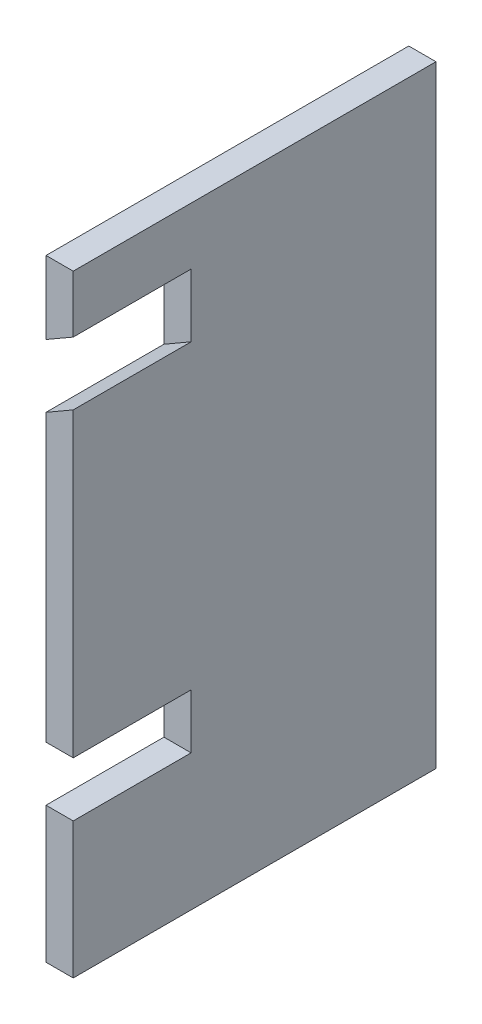
ISO-10303-21;
HEADER;
FILE_DESCRIPTION(('STEP AP214'),'2;1');
FILE_NAME('part.step','',(''),(''),'','','');
FILE_SCHEMA(('AUTOMOTIVE_DESIGN { 1 0 10303 214 1 1 1 1 }'));
ENDSEC;
DATA;
#1=APPLICATION_CONTEXT('core data for automotive mechanical design processes');
#2=APPLICATION_PROTOCOL_DEFINITION('international standard','automotive_design',2000,#1);
#3=PRODUCT_CONTEXT('',#1,'mechanical');
#4=PRODUCT('Part','Part','',(#3));
#5=PRODUCT_RELATED_PRODUCT_CATEGORY('part','',(#4));
#6=PRODUCT_DEFINITION_FORMATION('','',#4);
#7=PRODUCT_DEFINITION_CONTEXT('part definition',#1,'design');
#8=PRODUCT_DEFINITION('design','',#6,#7);
#9=PRODUCT_DEFINITION_SHAPE('','',#8);
#10=(LENGTH_UNIT() NAMED_UNIT(*) SI_UNIT(.MILLI.,.METRE.));
#11=(NAMED_UNIT(*) PLANE_ANGLE_UNIT() SI_UNIT($,.RADIAN.));
#12=(NAMED_UNIT(*) SI_UNIT($,.STERADIAN.) SOLID_ANGLE_UNIT());
#13=UNCERTAINTY_MEASURE_WITH_UNIT(LENGTH_MEASURE(1.E-05),#10,'distance_accuracy_value','');
#14=(GEOMETRIC_REPRESENTATION_CONTEXT(3) GLOBAL_UNCERTAINTY_ASSIGNED_CONTEXT((#13)) GLOBAL_UNIT_ASSIGNED_CONTEXT((#10,
#11,#12)) REPRESENTATION_CONTEXT('',''));
#15=CARTESIAN_POINT('',(0.,0.,0.));
#16=DIRECTION('',(0.,0.,1.));
#17=DIRECTION('',(1.,0.,0.));
#18=AXIS2_PLACEMENT_3D('',#15,#16,#17);
#19=CARTESIAN_POINT('',(0.,0.,80.));
#20=DIRECTION('',(0.,0.,1.));
#21=DIRECTION('',(1.,0.,0.));
#22=AXIS2_PLACEMENT_3D('',#19,#20,#21);
#23=PLANE('',#22);
#24=DIRECTION('',(-1.,0.,0.));
#25=VECTOR('',#24,1.);
#26=CARTESIAN_POINT('',(-3.00000000000001,-25.46,80.));
#27=LINE('',#26,#25);
#28=CARTESIAN_POINT('',(3.00000000000001,-25.46,80.));
#29=VERTEX_POINT('',#28);
#30=CARTESIAN_POINT('',(-3.00000000000001,-25.46,80.));
#31=VERTEX_POINT('',#30);
#32=EDGE_CURVE('E139',#29,#31,#27,.T.);
#33=ORIENTED_EDGE('',*,*,#32,.F.);
#34=DIRECTION('',(0.,1.,0.));
#35=VECTOR('',#34,1.);
#36=CARTESIAN_POINT('',(2.99999999999999,67.5,80.));
#37=LINE('',#36,#35);
#38=CARTESIAN_POINT('',(3.00000000000001,41.0041016151377,80.));
#39=VERTEX_POINT('',#38);
#40=EDGE_CURVE('E180',#29,#39,#37,.T.);
#41=ORIENTED_EDGE('',*,*,#40,.T.);
#42=DIRECTION('',(0.866025403784439,0.499999999999999,0.));
#43=VECTOR('',#42,1.);
#44=CARTESIAN_POINT('',(-3.00000000000001,37.54,80.));
#45=LINE('',#44,#43);
#46=CARTESIAN_POINT('',(-3.00000000000001,37.54,80.));
#47=VERTEX_POINT('',#46);
#48=EDGE_CURVE('E163',#47,#39,#45,.T.);
#49=ORIENTED_EDGE('',*,*,#48,.F.);
#50=DIRECTION('',(0.,-1.,0.));
#51=VECTOR('',#50,1.);
#52=CARTESIAN_POINT('',(-3.00000000000001,67.5,80.));
#53=LINE('',#52,#51);
#54=EDGE_CURVE('E187',#47,#31,#53,.T.);
#55=ORIENTED_EDGE('',*,*,#54,.T.);
#56=EDGE_LOOP('',(#33,#41,#49,#55));
#57=FACE_BOUND('',#56,.T.);
#58=ADVANCED_FACE('F35',(#57),#23,.T.);
#59=DIRECTION('',(-0.86602540378444,-0.499999999999998,0.));
#60=VECTOR('',#59,1.);
#61=CARTESIAN_POINT('',(-3.00000000000001,51.4425944820862,80.));
#62=LINE('',#61,#60);
#63=CARTESIAN_POINT('',(3.00000000000001,54.9066960972239,80.));
#64=VERTEX_POINT('',#63);
#65=CARTESIAN_POINT('',(-3.00000000000001,51.4425944820862,80.));
#66=VERTEX_POINT('',#65);
#67=EDGE_CURVE('E155',#64,#66,#62,.T.);
#68=ORIENTED_EDGE('',*,*,#67,.F.);
#69=CARTESIAN_POINT('',(2.99999999999999,67.5,80.));
#70=VERTEX_POINT('',#69);
#71=EDGE_CURVE('E181',#64,#70,#37,.T.);
#72=ORIENTED_EDGE('',*,*,#71,.T.);
#73=DIRECTION('',(-1.,0.,0.));
#74=VECTOR('',#73,1.);
#75=CARTESIAN_POINT('',(-3.00000000000001,67.5,80.));
#76=LINE('',#75,#74);
#77=CARTESIAN_POINT('',(-3.00000000000001,67.5,80.));
#78=VERTEX_POINT('',#77);
#79=EDGE_CURVE('E179',#70,#78,#76,.T.);
#80=ORIENTED_EDGE('',*,*,#79,.T.);
#81=EDGE_CURVE('E183',#78,#66,#53,.T.);
#82=ORIENTED_EDGE('',*,*,#81,.T.);
#83=EDGE_LOOP('',(#68,#72,#80,#82));
#84=FACE_BOUND('',#83,.T.);
#85=ADVANCED_FACE('F241',(#84),#23,.T.);
#86=CARTESIAN_POINT('',(2.99999999999999,67.5,80.));
#87=DIRECTION('',(-1.,0.,0.));
#88=DIRECTION('',(0.,-1.,0.));
#89=AXIS2_PLACEMENT_3D('',#86,#87,#88);
#90=PLANE('',#89);
#91=ORIENTED_EDGE('',*,*,#40,.F.);
#92=DIRECTION('',(0.,0.,1.));
#93=VECTOR('',#92,1.);
#94=CARTESIAN_POINT('',(3.00000000000001,-25.46,54.));
#95=LINE('',#94,#93);
#96=CARTESIAN_POINT('',(3.00000000000001,-25.46,54.));
#97=VERTEX_POINT('',#96);
#98=EDGE_CURVE('E146',#97,#29,#95,.T.);
#99=ORIENTED_EDGE('',*,*,#98,.F.);
#100=DIRECTION('',(0.,1.,0.));
#101=VECTOR('',#100,1.);
#102=CARTESIAN_POINT('',(3.00000000000001,-25.46,54.));
#103=LINE('',#102,#101);
#104=CARTESIAN_POINT('',(3.00000000000001,-37.5,54.));
#105=VERTEX_POINT('',#104);
#106=EDGE_CURVE('E129',#105,#97,#103,.T.);
#107=ORIENTED_EDGE('',*,*,#106,.F.);
#108=DIRECTION('',(0.,0.,1.));
#109=VECTOR('',#108,1.);
#110=CARTESIAN_POINT('',(3.00000000000001,-37.5,54.));
#111=LINE('',#110,#109);
#112=CARTESIAN_POINT('',(3.00000000000001,-37.5,80.));
#113=VERTEX_POINT('',#112);
#114=EDGE_CURVE('E126',#105,#113,#111,.T.);
#115=ORIENTED_EDGE('',*,*,#114,.T.);
#116=CARTESIAN_POINT('',(3.00000000000001,-67.5,80.));
#117=VERTEX_POINT('',#116);
#118=EDGE_CURVE('E176',#117,#113,#37,.T.);
#119=ORIENTED_EDGE('',*,*,#118,.F.);
#120=DIRECTION('',(0.,0.,-1.));
#121=VECTOR('',#120,1.);
#122=CARTESIAN_POINT('',(3.00000000000001,-67.5,80.));
#123=LINE('',#122,#121);
#124=CARTESIAN_POINT('',(3.00000000000001,-67.5,0.));
#125=VERTEX_POINT('',#124);
#126=EDGE_CURVE('E189',#117,#125,#123,.T.);
#127=ORIENTED_EDGE('',*,*,#126,.T.);
#128=DIRECTION('',(0.,1.,0.));
#129=VECTOR('',#128,1.);
#130=CARTESIAN_POINT('',(2.99999999999999,67.5,0.));
#131=LINE('',#130,#129);
#132=CARTESIAN_POINT('',(2.99999999999999,67.5,0.));
#133=VERTEX_POINT('',#132);
#134=EDGE_CURVE('E190',#125,#133,#131,.T.);
#135=ORIENTED_EDGE('',*,*,#134,.T.);
#136=DIRECTION('',(0.,0.,-1.));
#137=VECTOR('',#136,1.);
#138=CARTESIAN_POINT('',(2.99999999999999,67.5,80.));
#139=LINE('',#138,#137);
#140=EDGE_CURVE('E11',#70,#133,#139,.T.);
#141=ORIENTED_EDGE('',*,*,#140,.F.);
#142=ORIENTED_EDGE('',*,*,#71,.F.);
#143=DIRECTION('',(0.,0.,1.));
#144=VECTOR('',#143,1.);
#145=CARTESIAN_POINT('',(3.00000000000001,54.9066960972239,54.));
#146=LINE('',#145,#144);
#147=CARTESIAN_POINT('',(3.00000000000001,54.9066960972239,54.));
#148=VERTEX_POINT('',#147);
#149=EDGE_CURVE('E170',#148,#64,#146,.T.);
#150=ORIENTED_EDGE('',*,*,#149,.F.);
#151=DIRECTION('',(0.,1.,0.));
#152=VECTOR('',#151,1.);
#153=CARTESIAN_POINT('',(3.00000000000001,41.0041016151377,54.));
#154=LINE('',#153,#152);
#155=CARTESIAN_POINT('',(3.00000000000001,41.0041016151377,54.));
#156=VERTEX_POINT('',#155);
#157=EDGE_CURVE('E158',#156,#148,#154,.T.);
#158=ORIENTED_EDGE('',*,*,#157,.F.);
#159=DIRECTION('',(0.,0.,1.));
#160=VECTOR('',#159,1.);
#161=CARTESIAN_POINT('',(3.00000000000001,41.0041016151377,54.));
#162=LINE('',#161,#160);
#163=EDGE_CURVE('E172',#156,#39,#162,.T.);
#164=ORIENTED_EDGE('',*,*,#163,.T.);
#165=EDGE_LOOP('',(#91,#99,#107,#115,#119,#127,#135,#141,#142,#150,#158,#164));
#166=FACE_BOUND('',#165,.T.);
#167=ADVANCED_FACE('F37',(#166),#90,.F.);
#168=CARTESIAN_POINT('',(-3.00000000000001,67.5,80.));
#169=DIRECTION('',(0.,-1.,0.));
#170=DIRECTION('',(0.,0.,-1.));
#171=AXIS2_PLACEMENT_3D('',#168,#169,#170);
#172=PLANE('',#171);
#173=DIRECTION('',(-1.,0.,0.));
#174=VECTOR('',#173,1.);
#175=CARTESIAN_POINT('',(-3.00000000000001,67.5,0.));
#176=LINE('',#175,#174);
#177=CARTESIAN_POINT('',(-3.00000000000001,67.5,0.));
#178=VERTEX_POINT('',#177);
#179=EDGE_CURVE('E193',#133,#178,#176,.T.);
#180=ORIENTED_EDGE('',*,*,#179,.T.);
#181=DIRECTION('',(0.,0.,-1.));
#182=VECTOR('',#181,1.);
#183=CARTESIAN_POINT('',(-3.00000000000001,67.5,80.));
#184=LINE('',#183,#182);
#185=EDGE_CURVE('E43',#78,#178,#184,.T.);
#186=ORIENTED_EDGE('',*,*,#185,.F.);
#187=ORIENTED_EDGE('',*,*,#79,.F.);
#188=ORIENTED_EDGE('',*,*,#140,.T.);
#189=EDGE_LOOP('',(#180,#186,#187,#188));
#190=FACE_BOUND('',#189,.T.);
#191=ADVANCED_FACE('F243',(#190),#172,.F.);
#192=CARTESIAN_POINT('',(-3.00000000000001,67.5,80.));
#193=DIRECTION('',(1.,0.,0.));
#194=DIRECTION('',(0.,1.,0.));
#195=AXIS2_PLACEMENT_3D('',#192,#193,#194);
#196=PLANE('',#195);
#197=DIRECTION('',(0.,-1.,0.));
#198=VECTOR('',#197,1.);
#199=CARTESIAN_POINT('',(-3.00000000000001,-25.46,54.));
#200=LINE('',#199,#198);
#201=CARTESIAN_POINT('',(-3.00000000000001,-25.46,54.));
#202=VERTEX_POINT('',#201);
#203=CARTESIAN_POINT('',(-3.00000000000001,-37.5,54.));
#204=VERTEX_POINT('',#203);
#205=EDGE_CURVE('E130',#202,#204,#200,.T.);
#206=ORIENTED_EDGE('',*,*,#205,.F.);
#207=DIRECTION('',(0.,0.,1.));
#208=VECTOR('',#207,1.);
#209=CARTESIAN_POINT('',(-3.00000000000001,-25.46,54.));
#210=LINE('',#209,#208);
#211=EDGE_CURVE('E194',#202,#31,#210,.T.);
#212=ORIENTED_EDGE('',*,*,#211,.T.);
#213=ORIENTED_EDGE('',*,*,#54,.F.);
#214=DIRECTION('',(0.,0.,1.));
#215=VECTOR('',#214,1.);
#216=CARTESIAN_POINT('',(-3.00000000000001,37.54,54.));
#217=LINE('',#216,#215);
#218=CARTESIAN_POINT('',(-3.00000000000001,37.54,54.));
#219=VERTEX_POINT('',#218);
#220=EDGE_CURVE('E58',#219,#47,#217,.T.);
#221=ORIENTED_EDGE('',*,*,#220,.F.);
#222=DIRECTION('',(0.,-1.,0.));
#223=VECTOR('',#222,1.);
#224=CARTESIAN_POINT('',(-3.00000000000001,51.4425944820862,54.));
#225=LINE('',#224,#223);
#226=CARTESIAN_POINT('',(-3.00000000000001,51.4425944820862,54.));
#227=VERTEX_POINT('',#226);
#228=EDGE_CURVE('E151',#227,#219,#225,.T.);
#229=ORIENTED_EDGE('',*,*,#228,.F.);
#230=DIRECTION('',(0.,0.,1.));
#231=VECTOR('',#230,1.);
#232=CARTESIAN_POINT('',(-3.00000000000001,51.4425944820862,54.));
#233=LINE('',#232,#231);
#234=EDGE_CURVE('E166',#227,#66,#233,.T.);
#235=ORIENTED_EDGE('',*,*,#234,.T.);
#236=ORIENTED_EDGE('',*,*,#81,.F.);
#237=ORIENTED_EDGE('',*,*,#185,.T.);
#238=DIRECTION('',(0.,-1.,0.));
#239=VECTOR('',#238,1.);
#240=CARTESIAN_POINT('',(-3.00000000000001,67.5,0.));
#241=LINE('',#240,#239);
#242=CARTESIAN_POINT('',(-2.99999999999999,-67.5,0.));
#243=VERTEX_POINT('',#242);
#244=EDGE_CURVE('E196',#178,#243,#241,.T.);
#245=ORIENTED_EDGE('',*,*,#244,.T.);
#246=DIRECTION('',(0.,0.,-1.));
#247=VECTOR('',#246,1.);
#248=CARTESIAN_POINT('',(-2.99999999999999,-67.5,80.));
#249=LINE('',#248,#247);
#250=CARTESIAN_POINT('',(-2.99999999999999,-67.5,80.));
#251=VERTEX_POINT('',#250);
#252=EDGE_CURVE('E202',#251,#243,#249,.T.);
#253=ORIENTED_EDGE('',*,*,#252,.F.);
#254=CARTESIAN_POINT('',(-3.,-37.5,80.));
#255=VERTEX_POINT('',#254);
#256=EDGE_CURVE('E144',#255,#251,#53,.T.);
#257=ORIENTED_EDGE('',*,*,#256,.F.);
#258=DIRECTION('',(0.,0.,1.));
#259=VECTOR('',#258,1.);
#260=CARTESIAN_POINT('',(-3.00000000000001,-37.5,54.));
#261=LINE('',#260,#259);
#262=EDGE_CURVE('E50',#204,#255,#261,.T.);
#263=ORIENTED_EDGE('',*,*,#262,.F.);
#264=EDGE_LOOP('',(#206,#212,#213,#221,#229,#235,#236,#237,#245,#253,#257,#263));
#265=FACE_BOUND('',#264,.T.);
#266=ADVANCED_FACE('F142',(#265),#196,.F.);
#267=CARTESIAN_POINT('',(-2.99999999999999,-67.5,80.));
#268=DIRECTION('',(0.,1.,0.));
#269=DIRECTION('',(0.,0.,1.));
#270=AXIS2_PLACEMENT_3D('',#267,#268,#269);
#271=PLANE('',#270);
#272=DIRECTION('',(1.,0.,0.));
#273=VECTOR('',#272,1.);
#274=CARTESIAN_POINT('',(-2.99999999999999,-67.5,0.));
#275=LINE('',#274,#273);
#276=EDGE_CURVE('E198',#243,#125,#275,.T.);
#277=ORIENTED_EDGE('',*,*,#276,.T.);
#278=ORIENTED_EDGE('',*,*,#126,.F.);
#279=DIRECTION('',(1.,0.,0.));
#280=VECTOR('',#279,1.);
#281=CARTESIAN_POINT('',(-2.99999999999999,-67.5,80.));
#282=LINE('',#281,#280);
#283=EDGE_CURVE('E186',#251,#117,#282,.T.);
#284=ORIENTED_EDGE('',*,*,#283,.F.);
#285=ORIENTED_EDGE('',*,*,#252,.T.);
#286=EDGE_LOOP('',(#277,#278,#284,#285));
#287=FACE_BOUND('',#286,.T.);
#288=ADVANCED_FACE('F216',(#287),#271,.F.);
#289=DIRECTION('',(1.,0.,0.));
#290=VECTOR('',#289,1.);
#291=CARTESIAN_POINT('',(-3.00000000000001,-37.5,80.));
#292=LINE('',#291,#290);
#293=EDGE_CURVE('E169',#255,#113,#292,.T.);
#294=ORIENTED_EDGE('',*,*,#293,.F.);
#295=ORIENTED_EDGE('',*,*,#256,.T.);
#296=ORIENTED_EDGE('',*,*,#283,.T.);
#297=ORIENTED_EDGE('',*,*,#118,.T.);
#298=EDGE_LOOP('',(#294,#295,#296,#297));
#299=FACE_BOUND('',#298,.T.);
#300=ADVANCED_FACE('F223',(#299),#23,.T.);
#301=CARTESIAN_POINT('',(0.,0.,0.));
#302=DIRECTION('',(0.,0.,1.));
#303=DIRECTION('',(1.,0.,0.));
#304=AXIS2_PLACEMENT_3D('',#301,#302,#303);
#305=PLANE('',#304);
#306=ORIENTED_EDGE('',*,*,#134,.F.);
#307=ORIENTED_EDGE('',*,*,#276,.F.);
#308=ORIENTED_EDGE('',*,*,#244,.F.);
#309=ORIENTED_EDGE('',*,*,#179,.F.);
#310=EDGE_LOOP('',(#306,#307,#308,#309));
#311=FACE_BOUND('',#310,.T.);
#312=ADVANCED_FACE('F213',(#311),#305,.F.);
#313=CARTESIAN_POINT('',(-3.00000000000001,51.4425944820862,54.));
#314=DIRECTION('',(-0.499999999999998,0.86602540378444,0.));
#315=DIRECTION('',(-0.86602540378444,-0.499999999999998,0.));
#316=AXIS2_PLACEMENT_3D('',#313,#314,#315);
#317=PLANE('',#316);
#318=ORIENTED_EDGE('',*,*,#67,.T.);
#319=ORIENTED_EDGE('',*,*,#234,.F.);
#320=DIRECTION('',(-0.86602540378444,-0.499999999999998,0.));
#321=VECTOR('',#320,1.);
#322=CARTESIAN_POINT('',(-3.00000000000001,51.4425944820862,54.));
#323=LINE('',#322,#321);
#324=EDGE_CURVE('E160',#148,#227,#323,.T.);
#325=ORIENTED_EDGE('',*,*,#324,.F.);
#326=ORIENTED_EDGE('',*,*,#149,.T.);
#327=EDGE_LOOP('',(#318,#319,#325,#326));
#328=FACE_BOUND('',#327,.T.);
#329=ADVANCED_FACE('F262',(#328),#317,.F.);
#330=CARTESIAN_POINT('',(-3.00000000000001,37.54,54.));
#331=DIRECTION('',(0.499999999999999,-0.866025403784439,0.));
#332=DIRECTION('',(0.866025403784439,0.499999999999999,0.));
#333=AXIS2_PLACEMENT_3D('',#330,#331,#332);
#334=PLANE('',#333);
#335=ORIENTED_EDGE('',*,*,#48,.T.);
#336=ORIENTED_EDGE('',*,*,#163,.F.);
#337=DIRECTION('',(0.866025403784439,0.499999999999999,0.));
#338=VECTOR('',#337,1.);
#339=CARTESIAN_POINT('',(-3.00000000000001,37.54,54.));
#340=LINE('',#339,#338);
#341=EDGE_CURVE('E154',#219,#156,#340,.T.);
#342=ORIENTED_EDGE('',*,*,#341,.F.);
#343=ORIENTED_EDGE('',*,*,#220,.T.);
#344=EDGE_LOOP('',(#335,#336,#342,#343));
#345=FACE_BOUND('',#344,.T.);
#346=ADVANCED_FACE('F290',(#345),#334,.F.);
#347=CARTESIAN_POINT('',(0.,0.,54.));
#348=DIRECTION('',(0.,0.,1.));
#349=DIRECTION('',(1.,0.,0.));
#350=AXIS2_PLACEMENT_3D('',#347,#348,#349);
#351=PLANE('',#350);
#352=ORIENTED_EDGE('',*,*,#228,.T.);
#353=ORIENTED_EDGE('',*,*,#341,.T.);
#354=ORIENTED_EDGE('',*,*,#157,.T.);
#355=ORIENTED_EDGE('',*,*,#324,.T.);
#356=EDGE_LOOP('',(#352,#353,#354,#355));
#357=FACE_BOUND('',#356,.T.);
#358=ADVANCED_FACE('F301',(#357),#351,.T.);
#359=CARTESIAN_POINT('',(-3.00000000000001,-25.46,54.));
#360=DIRECTION('',(0.,1.,0.));
#361=DIRECTION('',(-1.,0.,0.));
#362=AXIS2_PLACEMENT_3D('',#359,#360,#361);
#363=PLANE('',#362);
#364=ORIENTED_EDGE('',*,*,#32,.T.);
#365=ORIENTED_EDGE('',*,*,#211,.F.);
#366=DIRECTION('',(-1.,0.,0.));
#367=VECTOR('',#366,1.);
#368=CARTESIAN_POINT('',(-3.00000000000001,-25.46,54.));
#369=LINE('',#368,#367);
#370=EDGE_CURVE('E136',#97,#202,#369,.T.);
#371=ORIENTED_EDGE('',*,*,#370,.F.);
#372=ORIENTED_EDGE('',*,*,#98,.T.);
#373=EDGE_LOOP('',(#364,#365,#371,#372));
#374=FACE_BOUND('',#373,.T.);
#375=ADVANCED_FACE('F236',(#374),#363,.F.);
#376=CARTESIAN_POINT('',(-3.00000000000001,-37.5,54.));
#377=DIRECTION('',(0.,-1.,0.));
#378=DIRECTION('',(0.,0.,-1.));
#379=AXIS2_PLACEMENT_3D('',#376,#377,#378);
#380=PLANE('',#379);
#381=ORIENTED_EDGE('',*,*,#293,.T.);
#382=ORIENTED_EDGE('',*,*,#114,.F.);
#383=DIRECTION('',(1.,0.,0.));
#384=VECTOR('',#383,1.);
#385=CARTESIAN_POINT('',(-3.00000000000001,-37.5,54.));
#386=LINE('',#385,#384);
#387=EDGE_CURVE('E122',#204,#105,#386,.T.);
#388=ORIENTED_EDGE('',*,*,#387,.F.);
#389=ORIENTED_EDGE('',*,*,#262,.T.);
#390=EDGE_LOOP('',(#381,#382,#388,#389));
#391=FACE_BOUND('',#390,.T.);
#392=ADVANCED_FACE('F124',(#391),#380,.F.);
#393=CARTESIAN_POINT('',(0.,0.,54.));
#394=DIRECTION('',(0.,0.,1.));
#395=DIRECTION('',(1.,0.,0.));
#396=AXIS2_PLACEMENT_3D('',#393,#394,#395);
#397=PLANE('',#396);
#398=ORIENTED_EDGE('',*,*,#205,.T.);
#399=ORIENTED_EDGE('',*,*,#387,.T.);
#400=ORIENTED_EDGE('',*,*,#106,.T.);
#401=ORIENTED_EDGE('',*,*,#370,.T.);
#402=EDGE_LOOP('',(#398,#399,#400,#401));
#403=FACE_BOUND('',#402,.T.);
#404=ADVANCED_FACE('F134',(#403),#397,.T.);
#405=CLOSED_SHELL('',(#58,#85,#167,#191,#266,#288,#300,#312,#329,#346,#358,#375,#392,#404));
#406=MANIFOLD_SOLID_BREP('B2',#405);
#407=ADVANCED_BREP_SHAPE_REPRESENTATION('',(#18,#406),#14);
#408=SHAPE_DEFINITION_REPRESENTATION(#9,#407);
ENDSEC;
END-ISO-10303-21;
